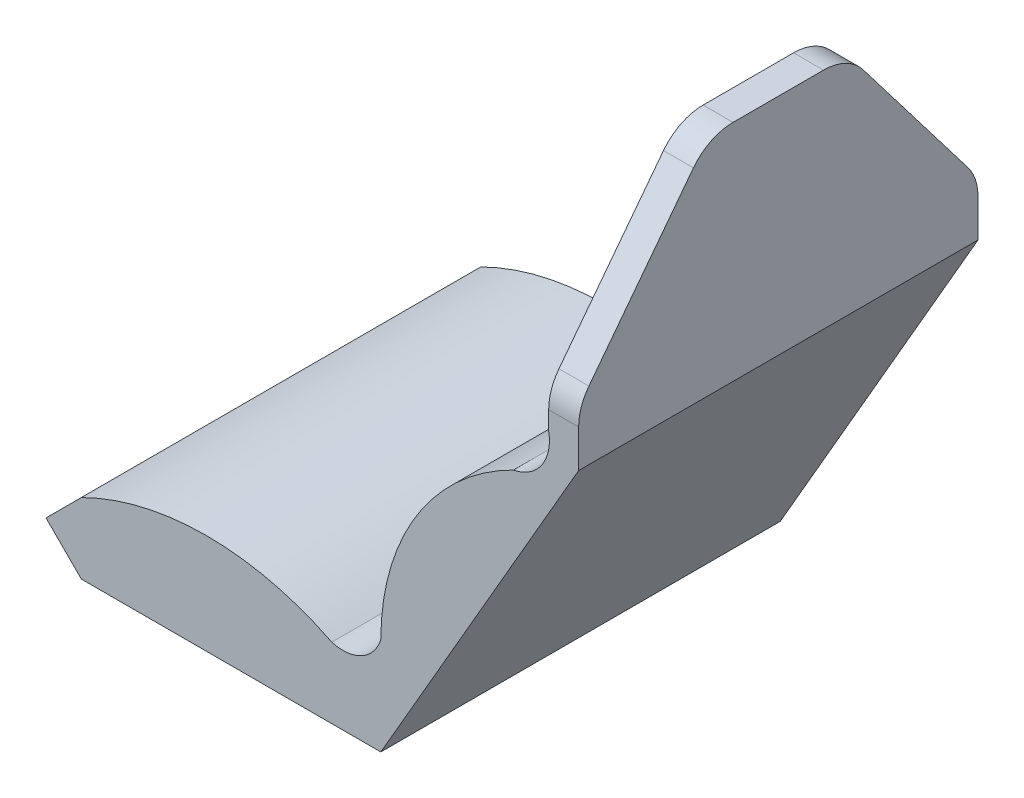
ISO-10303-21;
HEADER;
FILE_DESCRIPTION(('STEP AP214'),'2;1');
FILE_NAME('part.step','',(''),(''),'','','');
FILE_SCHEMA(('AUTOMOTIVE_DESIGN { 1 0 10303 214 1 1 1 1 }'));
ENDSEC;
DATA;
#1=APPLICATION_CONTEXT('core data for automotive mechanical design processes');
#2=APPLICATION_PROTOCOL_DEFINITION('international standard','automotive_design',2000,#1);
#3=PRODUCT_CONTEXT('',#1,'mechanical');
#4=PRODUCT('Part','Part','',(#3));
#5=PRODUCT_RELATED_PRODUCT_CATEGORY('part','',(#4));
#6=PRODUCT_DEFINITION_FORMATION('','',#4);
#7=PRODUCT_DEFINITION_CONTEXT('part definition',#1,'design');
#8=PRODUCT_DEFINITION('design','',#6,#7);
#9=PRODUCT_DEFINITION_SHAPE('','',#8);
#10=(LENGTH_UNIT() NAMED_UNIT(*) SI_UNIT(.MILLI.,.METRE.));
#11=(NAMED_UNIT(*) PLANE_ANGLE_UNIT() SI_UNIT($,.RADIAN.));
#12=(NAMED_UNIT(*) SI_UNIT($,.STERADIAN.) SOLID_ANGLE_UNIT());
#13=UNCERTAINTY_MEASURE_WITH_UNIT(LENGTH_MEASURE(1.E-05),#10,'distance_accuracy_value','');
#14=(GEOMETRIC_REPRESENTATION_CONTEXT(3) GLOBAL_UNCERTAINTY_ASSIGNED_CONTEXT((#13)) GLOBAL_UNIT_ASSIGNED_CONTEXT((#10,
#11,#12)) REPRESENTATION_CONTEXT('',''));
#15=CARTESIAN_POINT('',(0.,0.,0.));
#16=DIRECTION('',(0.,0.,1.));
#17=DIRECTION('',(1.,0.,0.));
#18=AXIS2_PLACEMENT_3D('',#15,#16,#17);
#19=CARTESIAN_POINT('',(0.,0.,-200.));
#20=DIRECTION('',(0.,-1.,0.));
#21=DIRECTION('',(1.,0.,0.));
#22=AXIS2_PLACEMENT_3D('',#19,#20,#21);
#23=PLANE('',#22);
#24=DIRECTION('',(1.,0.,0.));
#25=VECTOR('',#24,1.);
#26=CARTESIAN_POINT('',(0.,0.,0.));
#27=LINE('',#26,#25);
#28=CARTESIAN_POINT('',(-300.,0.,0.));
#29=VERTEX_POINT('',#28);
#30=CARTESIAN_POINT('',(0.,0.,0.));
#31=VERTEX_POINT('',#30);
#32=EDGE_CURVE('E169',#29,#31,#27,.T.);
#33=ORIENTED_EDGE('',*,*,#32,.F.);
#34=DIRECTION('',(0.,0.,1.));
#35=VECTOR('',#34,1.);
#36=CARTESIAN_POINT('',(-300.,0.,-200.));
#37=LINE('',#36,#35);
#38=CARTESIAN_POINT('',(-300.,0.,-400.));
#39=VERTEX_POINT('',#38);
#40=EDGE_CURVE('E240',#39,#29,#37,.T.);
#41=ORIENTED_EDGE('',*,*,#40,.F.);
#42=DIRECTION('',(1.,0.,0.));
#43=VECTOR('',#42,1.);
#44=CARTESIAN_POINT('',(0.,0.,-400.));
#45=LINE('',#44,#43);
#46=CARTESIAN_POINT('',(0.,0.,-400.));
#47=VERTEX_POINT('',#46);
#48=EDGE_CURVE('E211',#39,#47,#45,.T.);
#49=ORIENTED_EDGE('',*,*,#48,.T.);
#50=DIRECTION('',(0.,0.,1.));
#51=VECTOR('',#50,1.);
#52=CARTESIAN_POINT('',(0.,0.,-200.));
#53=LINE('',#52,#51);
#54=EDGE_CURVE('E183',#47,#31,#53,.T.);
#55=ORIENTED_EDGE('',*,*,#54,.T.);
#56=EDGE_LOOP('',(#33,#41,#49,#55));
#57=FACE_BOUND('',#56,.T.);
#58=CARTESIAN_POINT('',(-150.,0.,-200.));
#59=DIRECTION('',(0.,-1.,0.));
#60=DIRECTION('',(1.,0.,0.));
#61=AXIS2_PLACEMENT_3D('',#58,#59,#60);
#62=CIRCLE('',#61,20.);
#63=CARTESIAN_POINT('',(-130.,0.,-200.));
#64=VERTEX_POINT('',#63);
#65=EDGE_CURVE('E188',#64,#64,#62,.T.);
#66=ORIENTED_EDGE('',*,*,#65,.F.);
#67=EDGE_LOOP('',(#66));
#68=FACE_BOUND('',#67,.T.);
#69=ADVANCED_FACE('F38',(#57,#68),#23,.T.);
#70=CARTESIAN_POINT('',(198.118470760352,343.151257274782,-200.));
#71=DIRECTION('',(0.86602540378444,-0.499999999999998,0.));
#72=DIRECTION('',(0.499999999999998,0.86602540378444,0.));
#73=AXIS2_PLACEMENT_3D('',#70,#71,#72);
#74=PLANE('',#73);
#75=DIRECTION('',(0.499999999999998,0.86602540378444,0.));
#76=VECTOR('',#75,1.);
#77=CARTESIAN_POINT('',(198.118470760352,343.151257274782,0.));
#78=LINE('',#77,#76);
#79=CARTESIAN_POINT('',(198.118470760352,343.151257274782,0.));
#80=VERTEX_POINT('',#79);
#81=EDGE_CURVE('E213',#31,#80,#78,.T.);
#82=ORIENTED_EDGE('',*,*,#81,.F.);
#83=ORIENTED_EDGE('',*,*,#54,.F.);
#84=DIRECTION('',(0.499999999999998,0.86602540378444,0.));
#85=VECTOR('',#84,1.);
#86=CARTESIAN_POINT('',(198.118470760352,343.151257274782,-400.));
#87=LINE('',#86,#85);
#88=CARTESIAN_POINT('',(198.118470760352,343.151257274782,-400.));
#89=VERTEX_POINT('',#88);
#90=EDGE_CURVE('E177',#47,#89,#87,.T.);
#91=ORIENTED_EDGE('',*,*,#90,.T.);
#92=DIRECTION('',(0.,0.,1.));
#93=VECTOR('',#92,1.);
#94=CARTESIAN_POINT('',(198.118470760352,343.151257274782,-200.));
#95=LINE('',#94,#93);
#96=EDGE_CURVE('E158',#89,#80,#95,.T.);
#97=ORIENTED_EDGE('',*,*,#96,.T.);
#98=EDGE_LOOP('',(#82,#83,#91,#97));
#99=FACE_BOUND('',#98,.T.);
#100=ADVANCED_FACE('F182',(#99),#74,.T.);
#101=CARTESIAN_POINT('',(-300.,0.,-200.));
#102=DIRECTION('',(-0.707106781186548,-0.707106781186547,0.));
#103=DIRECTION('',(0.707106781186547,-0.707106781186548,0.));
#104=AXIS2_PLACEMENT_3D('',#101,#102,#103);
#105=PLANE('',#104);
#106=DIRECTION('',(0.707106781186547,-0.707106781186548,0.));
#107=VECTOR('',#106,1.);
#108=CARTESIAN_POINT('',(-300.,0.,0.));
#109=LINE('',#108,#107);
#110=CARTESIAN_POINT('',(-335.355339059327,35.3553390593273,0.));
#111=VERTEX_POINT('',#110);
#112=EDGE_CURVE('E233',#111,#29,#109,.T.);
#113=ORIENTED_EDGE('',*,*,#112,.F.);
#114=DIRECTION('',(0.,0.,1.));
#115=VECTOR('',#114,1.);
#116=CARTESIAN_POINT('',(-335.355339059327,35.3553390593273,-200.));
#117=LINE('',#116,#115);
#118=CARTESIAN_POINT('',(-335.355339059327,35.3553390593273,-400.));
#119=VERTEX_POINT('',#118);
#120=EDGE_CURVE('E242',#119,#111,#117,.T.);
#121=ORIENTED_EDGE('',*,*,#120,.F.);
#122=DIRECTION('',(0.707106781186547,-0.707106781186548,0.));
#123=VECTOR('',#122,1.);
#124=CARTESIAN_POINT('',(-300.,0.,-400.));
#125=LINE('',#124,#123);
#126=EDGE_CURVE('E208',#119,#39,#125,.T.);
#127=ORIENTED_EDGE('',*,*,#126,.T.);
#128=ORIENTED_EDGE('',*,*,#40,.T.);
#129=EDGE_LOOP('',(#113,#121,#127,#128));
#130=FACE_BOUND('',#129,.T.);
#131=ADVANCED_FACE('F327',(#130),#105,.T.);
#132=CARTESIAN_POINT('',(-335.355339059327,35.3553390593273,-200.));
#133=DIRECTION('',(-0.707106781186548,0.707106781186547,0.));
#134=DIRECTION('',(-0.707106781186547,-0.707106781186548,0.));
#135=AXIS2_PLACEMENT_3D('',#132,#133,#134);
#136=PLANE('',#135);
#137=DIRECTION('',(-0.707106781186547,-0.707106781186547,0.));
#138=VECTOR('',#137,1.);
#139=CARTESIAN_POINT('',(-335.355339059327,35.3553390593273,0.));
#140=LINE('',#139,#138);
#141=CARTESIAN_POINT('',(-300.,70.7106781186547,0.));
#142=VERTEX_POINT('',#141);
#143=EDGE_CURVE('E230',#142,#111,#140,.T.);
#144=ORIENTED_EDGE('',*,*,#143,.F.);
#145=DIRECTION('',(0.,0.,1.));
#146=VECTOR('',#145,1.);
#147=CARTESIAN_POINT('',(-300.,70.7106781186547,-200.));
#148=LINE('',#147,#146);
#149=CARTESIAN_POINT('',(-300.,70.7106781186547,-400.));
#150=VERTEX_POINT('',#149);
#151=EDGE_CURVE('E244',#150,#142,#148,.T.);
#152=ORIENTED_EDGE('',*,*,#151,.F.);
#153=DIRECTION('',(-0.707106781186547,-0.707106781186547,0.));
#154=VECTOR('',#153,1.);
#155=CARTESIAN_POINT('',(-335.355339059327,35.3553390593273,-400.));
#156=LINE('',#155,#154);
#157=EDGE_CURVE('E205',#150,#119,#156,.T.);
#158=ORIENTED_EDGE('',*,*,#157,.T.);
#159=ORIENTED_EDGE('',*,*,#120,.T.);
#160=EDGE_LOOP('',(#144,#152,#158,#159));
#161=FACE_BOUND('',#160,.T.);
#162=ADVANCED_FACE('F337',(#161),#136,.T.);
#163=CARTESIAN_POINT('',(-174.539840649313,-179.85101224792,-200.));
#164=DIRECTION('',(0.,0.,1.));
#165=DIRECTION('',(1.,0.,0.));
#166=AXIS2_PLACEMENT_3D('',#163,#164,#165);
#167=CYLINDRICAL_SURFACE('',#166,280.216723740135);
#168=CARTESIAN_POINT('',(-174.539840649313,-179.85101224792,0.));
#169=DIRECTION('',(0.,0.,1.));
#170=DIRECTION('',(-1.,0.,0.));
#171=AXIS2_PLACEMENT_3D('',#168,#169,#170);
#172=CIRCLE('',#171,280.216723740135);
#173=CARTESIAN_POINT('',(-49.0796812986252,70.7106781186548,0.));
#174=VERTEX_POINT('',#173);
#175=EDGE_CURVE('E227',#174,#142,#172,.T.);
#176=ORIENTED_EDGE('',*,*,#175,.F.);
#177=DIRECTION('',(0.,0.,1.));
#178=VECTOR('',#177,1.);
#179=CARTESIAN_POINT('',(-49.0796812986252,70.7106781186548,-200.));
#180=LINE('',#179,#178);
#181=CARTESIAN_POINT('',(-49.0796812986252,70.7106781186548,-400.));
#182=VERTEX_POINT('',#181);
#183=EDGE_CURVE('E246',#182,#174,#180,.T.);
#184=ORIENTED_EDGE('',*,*,#183,.F.);
#185=CARTESIAN_POINT('',(-174.539840649313,-179.85101224792,-400.));
#186=DIRECTION('',(0.,0.,1.));
#187=DIRECTION('',(-1.,0.,0.));
#188=AXIS2_PLACEMENT_3D('',#185,#186,#187);
#189=CIRCLE('',#188,280.216723740135);
#190=EDGE_CURVE('E202',#182,#150,#189,.T.);
#191=ORIENTED_EDGE('',*,*,#190,.T.);
#192=ORIENTED_EDGE('',*,*,#151,.T.);
#193=EDGE_LOOP('',(#176,#184,#191,#192));
#194=FACE_BOUND('',#193,.T.);
#195=ADVANCED_FACE('F341',(#194),#167,.T.);
#196=CARTESIAN_POINT('',(-38.0090993020909,108.719777420746,-200.));
#197=DIRECTION('',(0.,0.,1.));
#198=DIRECTION('',(1.,0.,0.));
#199=AXIS2_PLACEMENT_3D('',#196,#197,#198);
#200=CYLINDRICAL_SURFACE('',#199,39.5885010514189);
#201=CARTESIAN_POINT('',(-38.0090993020909,108.719777420746,0.));
#202=DIRECTION('',(0.,0.,-1.));
#203=DIRECTION('',(1.,0.,0.));
#204=AXIS2_PLACEMENT_3D('',#201,#202,#203);
#205=CIRCLE('',#204,39.5885010514189);
#206=CARTESIAN_POINT('',(0.,97.6491954242113,0.));
#207=VERTEX_POINT('',#206);
#208=EDGE_CURVE('E224',#207,#174,#205,.T.);
#209=ORIENTED_EDGE('',*,*,#208,.F.);
#210=DIRECTION('',(0.,0.,1.));
#211=VECTOR('',#210,1.);
#212=CARTESIAN_POINT('',(0.,97.6491954242113,-200.));
#213=LINE('',#212,#211);
#214=CARTESIAN_POINT('',(0.,97.6491954242113,-400.));
#215=VERTEX_POINT('',#214);
#216=EDGE_CURVE('E248',#215,#207,#213,.T.);
#217=ORIENTED_EDGE('',*,*,#216,.F.);
#218=CARTESIAN_POINT('',(-38.0090993020909,108.719777420746,-400.));
#219=DIRECTION('',(0.,0.,-1.));
#220=DIRECTION('',(1.,0.,0.));
#221=AXIS2_PLACEMENT_3D('',#218,#219,#220);
#222=CIRCLE('',#221,39.5885010514189);
#223=EDGE_CURVE('E199',#215,#182,#222,.T.);
#224=ORIENTED_EDGE('',*,*,#223,.T.);
#225=ORIENTED_EDGE('',*,*,#183,.T.);
#226=EDGE_LOOP('',(#209,#217,#224,#225));
#227=FACE_BOUND('',#226,.T.);
#228=ADVANCED_FACE('F345',(#227),#200,.F.);
#229=CARTESIAN_POINT('',(238.221396733766,97.326163691198,-200.));
#230=DIRECTION('',(0.,0.,1.));
#231=DIRECTION('',(1.,0.,0.));
#232=AXIS2_PLACEMENT_3D('',#229,#230,#231);
#233=CYLINDRICAL_SURFACE('',#232,238.221615751566);
#234=CARTESIAN_POINT('',(238.221396733766,97.326163691198,0.));
#235=DIRECTION('',(0.,0.,1.));
#236=DIRECTION('',(-1.,0.,0.));
#237=AXIS2_PLACEMENT_3D('',#234,#235,#236);
#238=CIRCLE('',#237,238.221615751566);
#239=CARTESIAN_POINT('',(132.842160393159,310.972494714123,0.));
#240=VERTEX_POINT('',#239);
#241=EDGE_CURVE('E221',#240,#207,#238,.T.);
#242=ORIENTED_EDGE('',*,*,#241,.F.);
#243=DIRECTION('',(0.,0.,1.));
#244=VECTOR('',#243,1.);
#245=CARTESIAN_POINT('',(132.842160393159,310.972494714123,-200.));
#246=LINE('',#245,#244);
#247=CARTESIAN_POINT('',(132.842160393159,310.972494714123,-400.));
#248=VERTEX_POINT('',#247);
#249=EDGE_CURVE('E250',#248,#240,#246,.T.);
#250=ORIENTED_EDGE('',*,*,#249,.F.);
#251=CARTESIAN_POINT('',(238.221396733766,97.326163691198,-400.));
#252=DIRECTION('',(0.,0.,1.));
#253=DIRECTION('',(-1.,0.,0.));
#254=AXIS2_PLACEMENT_3D('',#251,#252,#253);
#255=CIRCLE('',#254,238.221615751566);
#256=EDGE_CURVE('E196',#248,#215,#255,.T.);
#257=ORIENTED_EDGE('',*,*,#256,.T.);
#258=ORIENTED_EDGE('',*,*,#216,.T.);
#259=EDGE_LOOP('',(#242,#250,#257,#258));
#260=FACE_BOUND('',#259,.T.);
#261=ADVANCED_FACE('F349',(#260),#233,.T.);
#262=CARTESIAN_POINT('',(124.766093547545,354.32487192693,-200.));
#263=DIRECTION('',(0.,0.,1.));
#264=DIRECTION('',(1.,0.,0.));
#265=AXIS2_PLACEMENT_3D('',#262,#263,#264);
#266=CYLINDRICAL_SURFACE('',#265,44.0982025222835);
#267=CARTESIAN_POINT('',(124.766093547545,354.32487192693,0.));
#268=DIRECTION('',(0.,0.,-1.));
#269=DIRECTION('',(1.,0.,0.));
#270=AXIS2_PLACEMENT_3D('',#267,#268,#269);
#271=CIRCLE('',#270,44.0982025222835);
#272=CARTESIAN_POINT('',(168.118470760352,362.400938772544,0.));
#273=VERTEX_POINT('',#272);
#274=EDGE_CURVE('E218',#273,#240,#271,.T.);
#275=ORIENTED_EDGE('',*,*,#274,.F.);
#276=DIRECTION('',(0.,0.,1.));
#277=VECTOR('',#276,1.);
#278=CARTESIAN_POINT('',(168.118470760352,362.400938772544,-200.));
#279=LINE('',#278,#277);
#280=CARTESIAN_POINT('',(168.118470760352,362.400938772544,-400.));
#281=VERTEX_POINT('',#280);
#282=EDGE_CURVE('E252',#281,#273,#279,.T.);
#283=ORIENTED_EDGE('',*,*,#282,.F.);
#284=CARTESIAN_POINT('',(124.766093547545,354.32487192693,-400.));
#285=DIRECTION('',(0.,0.,-1.));
#286=DIRECTION('',(1.,0.,0.));
#287=AXIS2_PLACEMENT_3D('',#284,#285,#286);
#288=CIRCLE('',#287,44.0982025222835);
#289=EDGE_CURVE('E193',#281,#248,#288,.T.);
#290=ORIENTED_EDGE('',*,*,#289,.T.);
#291=ORIENTED_EDGE('',*,*,#249,.T.);
#292=EDGE_LOOP('',(#275,#283,#290,#291));
#293=FACE_BOUND('',#292,.T.);
#294=ADVANCED_FACE('F353',(#293),#266,.F.);
#295=CARTESIAN_POINT('',(168.118470760352,362.400938772544,-200.));
#296=DIRECTION('',(-1.,0.,0.));
#297=DIRECTION('',(0.,0.,1.));
#298=AXIS2_PLACEMENT_3D('',#295,#296,#297);
#299=PLANE('',#298);
#300=DIRECTION('',(0.,-0.794357832977197,-0.607450107570796));
#301=VECTOR('',#300,1.);
#302=CARTESIAN_POINT('',(168.118470760352,471.993483221346,-343.313327356127));
#303=LINE('',#302,#301);
#304=CARTESIAN_POINT('',(168.118470760352,548.237262834822,-285.009260592881));
#305=VERTEX_POINT('',#304);
#306=CARTESIAN_POINT('',(168.118470760352,411.310591453926,-389.71789164886));
#307=VERTEX_POINT('',#306);
#308=EDGE_CURVE('E264',#305,#307,#303,.T.);
#309=ORIENTED_EDGE('',*,*,#308,.T.);
#310=CARTESIAN_POINT('',(168.118470760352,380.938086075386,-350.));
#311=DIRECTION('',(-1.,0.,0.));
#312=DIRECTION('',(0.,0.,1.));
#313=AXIS2_PLACEMENT_3D('',#310,#311,#312);
#314=CIRCLE('',#313,50.);
#315=CARTESIAN_POINT('',(168.118470760352,380.938086075386,-400.));
#316=VERTEX_POINT('',#315);
#317=EDGE_CURVE('E288',#307,#316,#314,.T.);
#318=ORIENTED_EDGE('',*,*,#317,.T.);
#319=DIRECTION('',(0.,-1.,0.));
#320=VECTOR('',#319,1.);
#321=CARTESIAN_POINT('',(168.118470760352,362.400938772544,-400.));
#322=LINE('',#321,#320);
#323=EDGE_CURVE('E180',#316,#281,#322,.T.);
#324=ORIENTED_EDGE('',*,*,#323,.T.);
#325=ORIENTED_EDGE('',*,*,#282,.T.);
#326=DIRECTION('',(0.,-1.,0.));
#327=VECTOR('',#326,1.);
#328=CARTESIAN_POINT('',(168.118470760352,362.400938772544,0.));
#329=LINE('',#328,#327);
#330=CARTESIAN_POINT('',(168.118470760352,380.938086075386,0.));
#331=VERTEX_POINT('',#330);
#332=EDGE_CURVE('E216',#331,#273,#329,.T.);
#333=ORIENTED_EDGE('',*,*,#332,.F.);
#334=CARTESIAN_POINT('',(168.118470760352,380.938086075386,-50.));
#335=DIRECTION('',(-1.,0.,0.));
#336=DIRECTION('',(0.,0.,1.));
#337=AXIS2_PLACEMENT_3D('',#334,#335,#336);
#338=CIRCLE('',#337,50.);
#339=CARTESIAN_POINT('',(168.118470760352,411.310591453926,-10.2821083511401));
#340=VERTEX_POINT('',#339);
#341=EDGE_CURVE('E60',#331,#340,#338,.T.);
#342=ORIENTED_EDGE('',*,*,#341,.T.);
#343=DIRECTION('',(0.,0.794357832977197,-0.607450107570796));
#344=VECTOR('',#343,1.);
#345=CARTESIAN_POINT('',(168.118470760352,471.993483221346,-56.6866726438733));
#346=LINE('',#345,#344);
#347=CARTESIAN_POINT('',(168.118470760352,548.237262834822,-114.990739407119));
#348=VERTEX_POINT('',#347);
#349=EDGE_CURVE('E239',#340,#348,#346,.T.);
#350=ORIENTED_EDGE('',*,*,#349,.T.);
#351=CARTESIAN_POINT('',(168.118470760352,517.864757456282,-154.708631055979));
#352=DIRECTION('',(-1.,0.,0.));
#353=DIRECTION('',(0.,0.,1.));
#354=AXIS2_PLACEMENT_3D('',#351,#352,#353);
#355=CIRCLE('',#354,50.);
#356=CARTESIAN_POINT('',(168.118470760352,567.864757456282,-154.708631055979));
#357=VERTEX_POINT('',#356);
#358=EDGE_CURVE('E283',#348,#357,#355,.T.);
#359=ORIENTED_EDGE('',*,*,#358,.T.);
#360=DIRECTION('',(0.,0.,1.));
#361=VECTOR('',#360,1.);
#362=CARTESIAN_POINT('',(168.118470760352,567.864757456282,-200.));
#363=LINE('',#362,#361);
#364=CARTESIAN_POINT('',(168.118470760352,567.864757456282,-245.291368944021));
#365=VERTEX_POINT('',#364);
#366=EDGE_CURVE('E255',#365,#357,#363,.T.);
#367=ORIENTED_EDGE('',*,*,#366,.F.);
#368=CARTESIAN_POINT('',(168.118470760352,517.864757456282,-245.291368944021));
#369=DIRECTION('',(-1.,0.,0.));
#370=DIRECTION('',(0.,0.,1.));
#371=AXIS2_PLACEMENT_3D('',#368,#369,#370);
#372=CIRCLE('',#371,50.);
#373=EDGE_CURVE('E285',#365,#305,#372,.T.);
#374=ORIENTED_EDGE('',*,*,#373,.T.);
#375=EDGE_LOOP('',(#309,#318,#324,#325,#333,#342,#350,#359,#367,#374));
#376=FACE_BOUND('',#375,.T.);
#377=ADVANCED_FACE('F309',(#376),#299,.T.);
#378=CARTESIAN_POINT('',(168.118470760352,567.864757456282,-200.));
#379=DIRECTION('',(0.,1.,0.));
#380=DIRECTION('',(0.,0.,1.));
#381=AXIS2_PLACEMENT_3D('',#378,#379,#380);
#382=PLANE('',#381);
#383=DIRECTION('',(0.,0.,1.));
#384=VECTOR('',#383,1.);
#385=CARTESIAN_POINT('',(198.118470760352,567.864757456282,-200.));
#386=LINE('',#385,#384);
#387=CARTESIAN_POINT('',(198.118470760352,567.864757456282,-245.291368944021));
#388=VERTEX_POINT('',#387);
#389=CARTESIAN_POINT('',(198.118470760352,567.864757456282,-154.708631055979));
#390=VERTEX_POINT('',#389);
#391=EDGE_CURVE('E168',#388,#390,#386,.T.);
#392=ORIENTED_EDGE('',*,*,#391,.F.);
#393=DIRECTION('',(-1.,0.,0.));
#394=VECTOR('',#393,1.);
#395=CARTESIAN_POINT('',(168.118470760352,567.864757456282,-245.291368944021));
#396=LINE('',#395,#394);
#397=EDGE_CURVE('E11',#388,#365,#396,.T.);
#398=ORIENTED_EDGE('',*,*,#397,.T.);
#399=ORIENTED_EDGE('',*,*,#366,.T.);
#400=DIRECTION('',(1.,0.,0.));
#401=VECTOR('',#400,1.);
#402=CARTESIAN_POINT('',(168.118470760352,567.864757456282,-154.708631055979));
#403=LINE('',#402,#401);
#404=EDGE_CURVE('E46',#357,#390,#403,.T.);
#405=ORIENTED_EDGE('',*,*,#404,.T.);
#406=EDGE_LOOP('',(#392,#398,#399,#405));
#407=FACE_BOUND('',#406,.T.);
#408=ADVANCED_FACE('F299',(#407),#382,.T.);
#409=CARTESIAN_POINT('',(198.118470760352,567.864757456282,-200.));
#410=DIRECTION('',(1.,0.,0.));
#411=DIRECTION('',(0.,0.,-1.));
#412=AXIS2_PLACEMENT_3D('',#409,#410,#411);
#413=PLANE('',#412);
#414=DIRECTION('',(0.,1.,0.));
#415=VECTOR('',#414,1.);
#416=CARTESIAN_POINT('',(198.118470760352,567.864757456282,-400.));
#417=LINE('',#416,#415);
#418=CARTESIAN_POINT('',(198.118470760352,380.938086075386,-400.));
#419=VERTEX_POINT('',#418);
#420=EDGE_CURVE('E161',#89,#419,#417,.T.);
#421=ORIENTED_EDGE('',*,*,#420,.T.);
#422=CARTESIAN_POINT('',(198.118470760352,380.938086075386,-350.));
#423=DIRECTION('',(1.,0.,0.));
#424=DIRECTION('',(0.,0.,-1.));
#425=AXIS2_PLACEMENT_3D('',#422,#423,#424);
#426=CIRCLE('',#425,50.);
#427=CARTESIAN_POINT('',(198.118470760352,411.310591453926,-389.71789164886));
#428=VERTEX_POINT('',#427);
#429=EDGE_CURVE('E277',#419,#428,#426,.T.);
#430=ORIENTED_EDGE('',*,*,#429,.T.);
#431=DIRECTION('',(0.,0.794357832977197,0.607450107570796));
#432=VECTOR('',#431,1.);
#433=CARTESIAN_POINT('',(198.118470760352,601.642050032701,-244.170305676856));
#434=LINE('',#433,#432);
#435=CARTESIAN_POINT('',(198.118470760352,548.237262834822,-285.009260592881));
#436=VERTEX_POINT('',#435);
#437=EDGE_CURVE('E267',#428,#436,#434,.T.);
#438=ORIENTED_EDGE('',*,*,#437,.T.);
#439=CARTESIAN_POINT('',(198.118470760352,517.864757456282,-245.291368944021));
#440=DIRECTION('',(1.,0.,0.));
#441=DIRECTION('',(0.,0.,-1.));
#442=AXIS2_PLACEMENT_3D('',#439,#440,#441);
#443=CIRCLE('',#442,50.);
#444=EDGE_CURVE('E273',#436,#388,#443,.T.);
#445=ORIENTED_EDGE('',*,*,#444,.T.);
#446=ORIENTED_EDGE('',*,*,#391,.T.);
#447=CARTESIAN_POINT('',(198.118470760352,517.864757456282,-154.708631055979));
#448=DIRECTION('',(1.,0.,0.));
#449=DIRECTION('',(0.,0.,-1.));
#450=AXIS2_PLACEMENT_3D('',#447,#448,#449);
#451=CIRCLE('',#450,50.);
#452=CARTESIAN_POINT('',(198.118470760352,548.237262834822,-114.990739407119));
#453=VERTEX_POINT('',#452);
#454=EDGE_CURVE('E271',#390,#453,#451,.T.);
#455=ORIENTED_EDGE('',*,*,#454,.T.);
#456=DIRECTION('',(0.,-0.794357832977197,0.607450107570796));
#457=VECTOR('',#456,1.);
#458=CARTESIAN_POINT('',(198.118470760352,601.642050032701,-155.829694323144));
#459=LINE('',#458,#457);
#460=CARTESIAN_POINT('',(198.118470760352,411.310591453926,-10.2821083511401));
#461=VERTEX_POINT('',#460);
#462=EDGE_CURVE('E261',#453,#461,#459,.T.);
#463=ORIENTED_EDGE('',*,*,#462,.T.);
#464=CARTESIAN_POINT('',(198.118470760352,380.938086075386,-50.));
#465=DIRECTION('',(1.,0.,0.));
#466=DIRECTION('',(0.,0.,-1.));
#467=AXIS2_PLACEMENT_3D('',#464,#465,#466);
#468=CIRCLE('',#467,50.);
#469=CARTESIAN_POINT('',(198.118470760352,380.938086075386,0.));
#470=VERTEX_POINT('',#469);
#471=EDGE_CURVE('E275',#461,#470,#468,.T.);
#472=ORIENTED_EDGE('',*,*,#471,.T.);
#473=DIRECTION('',(0.,1.,0.));
#474=VECTOR('',#473,1.);
#475=CARTESIAN_POINT('',(198.118470760352,567.864757456282,0.));
#476=LINE('',#475,#474);
#477=EDGE_CURVE('E163',#80,#470,#476,.T.);
#478=ORIENTED_EDGE('',*,*,#477,.F.);
#479=ORIENTED_EDGE('',*,*,#96,.F.);
#480=EDGE_LOOP('',(#421,#430,#438,#445,#446,#455,#463,#472,#478,#479));
#481=FACE_BOUND('',#480,.T.);
#482=ADVANCED_FACE('F160',(#481),#413,.T.);
#483=CARTESIAN_POINT('',(-174.539840649313,-179.85101224792,0.));
#484=DIRECTION('',(0.,0.,-1.));
#485=DIRECTION('',(-1.,0.,0.));
#486=AXIS2_PLACEMENT_3D('',#483,#484,#485);
#487=PLANE('',#486);
#488=ORIENTED_EDGE('',*,*,#477,.T.);
#489=DIRECTION('',(-1.,0.,0.));
#490=VECTOR('',#489,1.);
#491=CARTESIAN_POINT('',(168.118470760352,380.938086075386,0.));
#492=LINE('',#491,#490);
#493=EDGE_CURVE('E290',#470,#331,#492,.T.);
#494=ORIENTED_EDGE('',*,*,#493,.T.);
#495=ORIENTED_EDGE('',*,*,#332,.T.);
#496=ORIENTED_EDGE('',*,*,#274,.T.);
#497=ORIENTED_EDGE('',*,*,#241,.T.);
#498=ORIENTED_EDGE('',*,*,#208,.T.);
#499=ORIENTED_EDGE('',*,*,#175,.T.);
#500=ORIENTED_EDGE('',*,*,#143,.T.);
#501=ORIENTED_EDGE('',*,*,#112,.T.);
#502=ORIENTED_EDGE('',*,*,#32,.T.);
#503=ORIENTED_EDGE('',*,*,#81,.T.);
#504=EDGE_LOOP('',(#488,#494,#495,#496,#497,#498,#499,#500,#501,#502,#503));
#505=FACE_BOUND('',#504,.T.);
#506=ADVANCED_FACE('F333',(#505),#487,.F.);
#507=CARTESIAN_POINT('',(-174.539840649313,-179.85101224792,-400.));
#508=DIRECTION('',(0.,0.,1.));
#509=DIRECTION('',(-1.,0.,0.));
#510=AXIS2_PLACEMENT_3D('',#507,#508,#509);
#511=PLANE('',#510);
#512=ORIENTED_EDGE('',*,*,#323,.F.);
#513=DIRECTION('',(1.,0.,0.));
#514=VECTOR('',#513,1.);
#515=CARTESIAN_POINT('',(198.118470760352,380.938086075386,-400.));
#516=LINE('',#515,#514);
#517=EDGE_CURVE('E179',#316,#419,#516,.T.);
#518=ORIENTED_EDGE('',*,*,#517,.T.);
#519=ORIENTED_EDGE('',*,*,#420,.F.);
#520=ORIENTED_EDGE('',*,*,#90,.F.);
#521=ORIENTED_EDGE('',*,*,#48,.F.);
#522=ORIENTED_EDGE('',*,*,#126,.F.);
#523=ORIENTED_EDGE('',*,*,#157,.F.);
#524=ORIENTED_EDGE('',*,*,#190,.F.);
#525=ORIENTED_EDGE('',*,*,#223,.F.);
#526=ORIENTED_EDGE('',*,*,#256,.F.);
#527=ORIENTED_EDGE('',*,*,#289,.F.);
#528=EDGE_LOOP('',(#512,#518,#519,#520,#521,#522,#523,#524,#525,#526,#527));
#529=FACE_BOUND('',#528,.T.);
#530=ADVANCED_FACE('F175',(#529),#511,.F.);
#531=CARTESIAN_POINT('',(-174.539840649313,397.864757456281,0.));
#532=DIRECTION('',(0.,0.607450107570796,0.794357832977197));
#533=DIRECTION('',(1.,0.,0.));
#534=AXIS2_PLACEMENT_3D('',#531,#532,#533);
#535=PLANE('',#534);
#536=ORIENTED_EDGE('',*,*,#349,.F.);
#537=DIRECTION('',(-1.,0.,0.));
#538=VECTOR('',#537,1.);
#539=CARTESIAN_POINT('',(198.118470760352,411.310591453926,-10.2821083511401));
#540=LINE('',#539,#538);
#541=EDGE_CURVE('E294',#340,#461,#540,.F.);
#542=ORIENTED_EDGE('',*,*,#541,.T.);
#543=ORIENTED_EDGE('',*,*,#462,.F.);
#544=DIRECTION('',(1.,0.,0.));
#545=VECTOR('',#544,1.);
#546=CARTESIAN_POINT('',(-174.539840649313,548.237262834822,-114.990739407119));
#547=LINE('',#546,#545);
#548=EDGE_CURVE('E53',#453,#348,#547,.F.);
#549=ORIENTED_EDGE('',*,*,#548,.T.);
#550=EDGE_LOOP('',(#536,#542,#543,#549));
#551=FACE_BOUND('',#550,.T.);
#552=ADVANCED_FACE('F364',(#551),#535,.T.);
#553=CARTESIAN_POINT('',(168.118470760352,567.864757456282,-270.));
#554=DIRECTION('',(0.,0.607450107570796,-0.794357832977197));
#555=DIRECTION('',(1.,0.,0.));
#556=AXIS2_PLACEMENT_3D('',#553,#554,#555);
#557=PLANE('',#556);
#558=ORIENTED_EDGE('',*,*,#437,.F.);
#559=DIRECTION('',(1.,0.,0.));
#560=VECTOR('',#559,1.);
#561=CARTESIAN_POINT('',(168.118470760352,411.310591453926,-389.71789164886));
#562=LINE('',#561,#560);
#563=EDGE_CURVE('E281',#428,#307,#562,.F.);
#564=ORIENTED_EDGE('',*,*,#563,.T.);
#565=ORIENTED_EDGE('',*,*,#308,.F.);
#566=DIRECTION('',(-1.,0.,0.));
#567=VECTOR('',#566,1.);
#568=CARTESIAN_POINT('',(168.118470760352,548.237262834822,-285.009260592881));
#569=LINE('',#568,#567);
#570=EDGE_CURVE('E279',#305,#436,#569,.F.);
#571=ORIENTED_EDGE('',*,*,#570,.T.);
#572=EDGE_LOOP('',(#558,#564,#565,#571));
#573=FACE_BOUND('',#572,.T.);
#574=ADVANCED_FACE('F367',(#573),#557,.T.);
#575=CARTESIAN_POINT('',(-174.539840649313,380.938086075386,-350.));
#576=DIRECTION('',(-1.,0.,0.));
#577=DIRECTION('',(0.,0.,1.));
#578=AXIS2_PLACEMENT_3D('',#575,#576,#577);
#579=CYLINDRICAL_SURFACE('',#578,50.);
#580=ORIENTED_EDGE('',*,*,#317,.F.);
#581=ORIENTED_EDGE('',*,*,#563,.F.);
#582=ORIENTED_EDGE('',*,*,#429,.F.);
#583=ORIENTED_EDGE('',*,*,#517,.F.);
#584=EDGE_LOOP('',(#580,#581,#582,#583));
#585=FACE_BOUND('',#584,.T.);
#586=ADVANCED_FACE('F370',(#585),#579,.T.);
#587=CARTESIAN_POINT('',(-174.539840649313,380.938086075386,-50.));
#588=DIRECTION('',(1.,0.,0.));
#589=DIRECTION('',(0.,0.,-1.));
#590=AXIS2_PLACEMENT_3D('',#587,#588,#589);
#591=CYLINDRICAL_SURFACE('',#590,50.);
#592=ORIENTED_EDGE('',*,*,#471,.F.);
#593=ORIENTED_EDGE('',*,*,#541,.F.);
#594=ORIENTED_EDGE('',*,*,#341,.F.);
#595=ORIENTED_EDGE('',*,*,#493,.F.);
#596=EDGE_LOOP('',(#592,#593,#594,#595));
#597=FACE_BOUND('',#596,.T.);
#598=ADVANCED_FACE('F320',(#597),#591,.T.);
#599=CARTESIAN_POINT('',(168.118470760352,517.864757456282,-245.291368944021));
#600=DIRECTION('',(-1.,0.,0.));
#601=DIRECTION('',(0.,0.,1.));
#602=AXIS2_PLACEMENT_3D('',#599,#600,#601);
#603=CYLINDRICAL_SURFACE('',#602,50.);
#604=ORIENTED_EDGE('',*,*,#444,.F.);
#605=ORIENTED_EDGE('',*,*,#570,.F.);
#606=ORIENTED_EDGE('',*,*,#373,.F.);
#607=ORIENTED_EDGE('',*,*,#397,.F.);
#608=EDGE_LOOP('',(#604,#605,#606,#607));
#609=FACE_BOUND('',#608,.T.);
#610=ADVANCED_FACE('F308',(#609),#603,.T.);
#611=CARTESIAN_POINT('',(168.118470760352,517.864757456282,-154.708631055979));
#612=DIRECTION('',(1.,0.,0.));
#613=DIRECTION('',(0.,0.,-1.));
#614=AXIS2_PLACEMENT_3D('',#611,#612,#613);
#615=CYLINDRICAL_SURFACE('',#614,50.);
#616=ORIENTED_EDGE('',*,*,#358,.F.);
#617=ORIENTED_EDGE('',*,*,#548,.F.);
#618=ORIENTED_EDGE('',*,*,#454,.F.);
#619=ORIENTED_EDGE('',*,*,#404,.F.);
#620=EDGE_LOOP('',(#616,#617,#618,#619));
#621=FACE_BOUND('',#620,.T.);
#622=ADVANCED_FACE('F40',(#621),#615,.T.);
#623=CARTESIAN_POINT('',(-150.,-10.,-200.));
#624=DIRECTION('',(0.,1.,0.));
#625=DIRECTION('',(-1.,0.,0.));
#626=AXIS2_PLACEMENT_3D('',#623,#624,#625);
#627=CYLINDRICAL_SURFACE('',#626,20.);
#628=CARTESIAN_POINT('',(-150.,-10.,-200.));
#629=DIRECTION('',(0.,-1.,0.));
#630=DIRECTION('',(1.,0.,0.));
#631=AXIS2_PLACEMENT_3D('',#628,#629,#630);
#632=CIRCLE('',#631,20.);
#633=CARTESIAN_POINT('',(-130.,-10.,-200.));
#634=VERTEX_POINT('',#633);
#635=EDGE_CURVE('E185',#634,#634,#632,.T.);
#636=ORIENTED_EDGE('',*,*,#635,.F.);
#637=EDGE_LOOP('',(#636));
#638=FACE_BOUND('',#637,.T.);
#639=ORIENTED_EDGE('',*,*,#65,.T.);
#640=EDGE_LOOP('',(#639));
#641=FACE_BOUND('',#640,.T.);
#642=ADVANCED_FACE('F312',(#638,#641),#627,.T.);
#643=CARTESIAN_POINT('',(-150.,-10.,-200.));
#644=DIRECTION('',(0.,-1.,0.));
#645=DIRECTION('',(1.,0.,0.));
#646=AXIS2_PLACEMENT_3D('',#643,#644,#645);
#647=PLANE('',#646);
#648=ORIENTED_EDGE('',*,*,#635,.T.);
#649=EDGE_LOOP('',(#648));
#650=FACE_BOUND('',#649,.T.);
#651=ADVANCED_FACE('F317',(#650),#647,.T.);
#652=CLOSED_SHELL('',(#69,#100,#131,#162,#195,#228,#261,#294,#377,#408,#482,#506,#530,#552,#574,
#586,#598,#610,#622,#642,#651));
#653=MANIFOLD_SOLID_BREP('B2',#652);
#654=ADVANCED_BREP_SHAPE_REPRESENTATION('',(#18,#653),#14);
#655=SHAPE_DEFINITION_REPRESENTATION(#9,#654);
ENDSEC;
END-ISO-10303-21;
